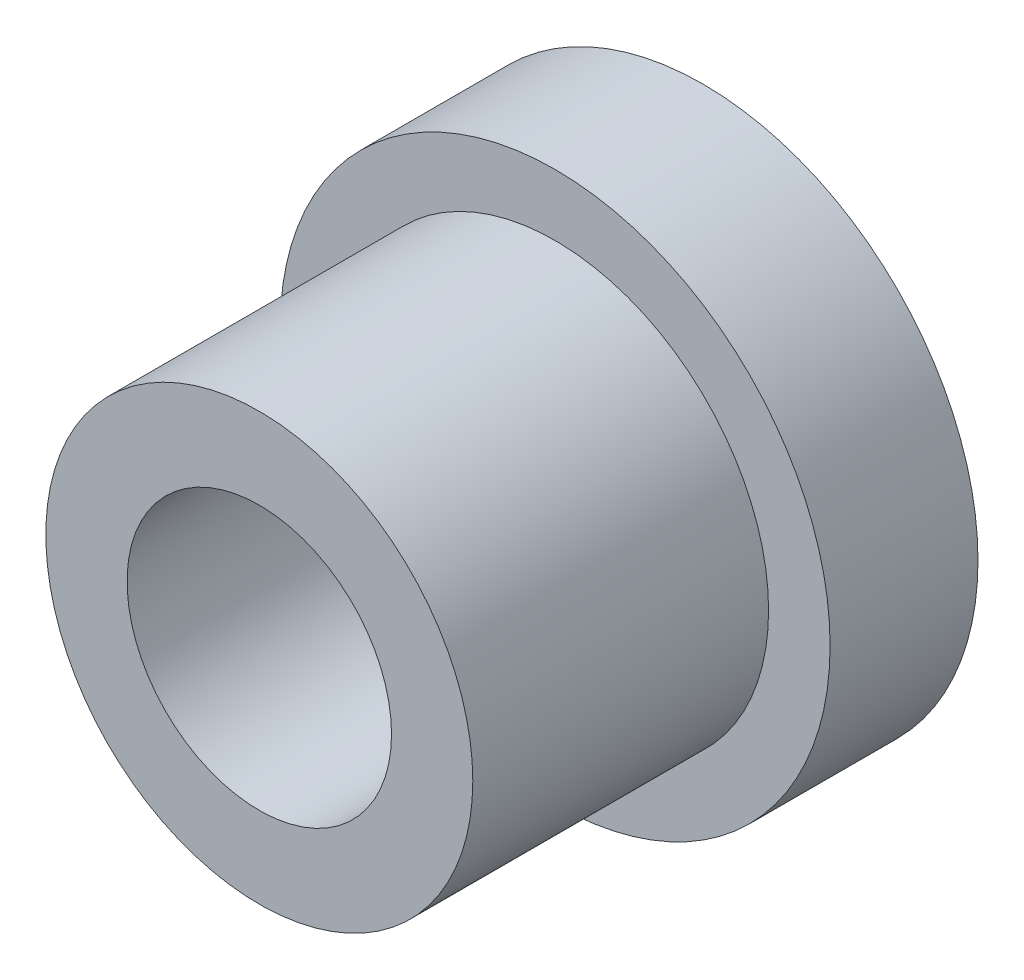
ISO-10303-21;
HEADER;
FILE_DESCRIPTION(('STEP AP214'),'2;1');
FILE_NAME('part.step','',(''),(''),'','','');
FILE_SCHEMA(('AUTOMOTIVE_DESIGN { 1 0 10303 214 1 1 1 1 }'));
ENDSEC;
DATA;
#1=APPLICATION_CONTEXT('core data for automotive mechanical design processes');
#2=APPLICATION_PROTOCOL_DEFINITION('international standard','automotive_design',2000,#1);
#3=PRODUCT_CONTEXT('',#1,'mechanical');
#4=PRODUCT('Part','Part','',(#3));
#5=PRODUCT_RELATED_PRODUCT_CATEGORY('part','',(#4));
#6=PRODUCT_DEFINITION_FORMATION('','',#4);
#7=PRODUCT_DEFINITION_CONTEXT('part definition',#1,'design');
#8=PRODUCT_DEFINITION('design','',#6,#7);
#9=PRODUCT_DEFINITION_SHAPE('','',#8);
#10=(LENGTH_UNIT() NAMED_UNIT(*) SI_UNIT(.MILLI.,.METRE.));
#11=(NAMED_UNIT(*) PLANE_ANGLE_UNIT() SI_UNIT($,.RADIAN.));
#12=(NAMED_UNIT(*) SI_UNIT($,.STERADIAN.) SOLID_ANGLE_UNIT());
#13=UNCERTAINTY_MEASURE_WITH_UNIT(LENGTH_MEASURE(1.E-05),#10,'distance_accuracy_value','');
#14=(GEOMETRIC_REPRESENTATION_CONTEXT(3) GLOBAL_UNCERTAINTY_ASSIGNED_CONTEXT((#13)) GLOBAL_UNIT_ASSIGNED_CONTEXT((#10,
#11,#12)) REPRESENTATION_CONTEXT('',''));
#15=CARTESIAN_POINT('',(0.,0.,0.));
#16=DIRECTION('',(0.,0.,1.));
#17=DIRECTION('',(1.,0.,0.));
#18=AXIS2_PLACEMENT_3D('',#15,#16,#17);
#19=CARTESIAN_POINT('',(0.,0.,10.));
#20=DIRECTION('',(0.,0.,1.));
#21=DIRECTION('',(1.,0.,0.));
#22=AXIS2_PLACEMENT_3D('',#19,#20,#21);
#23=PLANE('',#22);
#24=CARTESIAN_POINT('',(0.,0.,10.));
#25=DIRECTION('',(0.,0.,1.));
#26=DIRECTION('',(1.,0.,0.));
#27=AXIS2_PLACEMENT_3D('',#24,#25,#26);
#28=CIRCLE('',#27,7.21749079390016);
#29=CARTESIAN_POINT('',(7.21749079390016,0.,10.));
#30=VERTEX_POINT('',#29);
#31=EDGE_CURVE('E10',#30,#30,#28,.T.);
#32=ORIENTED_EDGE('',*,*,#31,.T.);
#33=EDGE_LOOP('',(#32));
#34=FACE_BOUND('',#33,.T.);
#35=CARTESIAN_POINT('',(0.,0.,10.));
#36=DIRECTION('',(0.,0.,1.));
#37=DIRECTION('',(1.,0.,0.));
#38=AXIS2_PLACEMENT_3D('',#35,#36,#37);
#39=CIRCLE('',#38,4.47);
#40=CARTESIAN_POINT('',(4.47,0.,10.));
#41=VERTEX_POINT('',#40);
#42=EDGE_CURVE('E39',#41,#41,#39,.T.);
#43=ORIENTED_EDGE('',*,*,#42,.F.);
#44=EDGE_LOOP('',(#43));
#45=FACE_BOUND('',#44,.T.);
#46=ADVANCED_FACE('F31',(#34,#45),#23,.T.);
#47=CARTESIAN_POINT('',(0.,0.,10.));
#48=DIRECTION('',(0.,0.,-1.));
#49=DIRECTION('',(-1.,0.,0.));
#50=AXIS2_PLACEMENT_3D('',#47,#48,#49);
#51=CYLINDRICAL_SURFACE('',#50,7.21749079390016);
#52=ORIENTED_EDGE('',*,*,#31,.F.);
#53=EDGE_LOOP('',(#52));
#54=FACE_BOUND('',#53,.T.);
#55=CARTESIAN_POINT('',(0.,0.,0.));
#56=DIRECTION('',(0.,0.,1.));
#57=DIRECTION('',(1.,0.,0.));
#58=AXIS2_PLACEMENT_3D('',#55,#56,#57);
#59=CIRCLE('',#58,7.21749079390016);
#60=CARTESIAN_POINT('',(7.21749079390016,0.,0.));
#61=VERTEX_POINT('',#60);
#62=EDGE_CURVE('E35',#61,#61,#59,.T.);
#63=ORIENTED_EDGE('',*,*,#62,.T.);
#64=EDGE_LOOP('',(#63));
#65=FACE_BOUND('',#64,.T.);
#66=ADVANCED_FACE('F33',(#54,#65),#51,.T.);
#67=CARTESIAN_POINT('',(0.,0.,10.));
#68=DIRECTION('',(0.,0.,-1.));
#69=DIRECTION('',(-1.,0.,0.));
#70=AXIS2_PLACEMENT_3D('',#67,#68,#69);
#71=CYLINDRICAL_SURFACE('',#70,4.47);
#72=ORIENTED_EDGE('',*,*,#42,.T.);
#73=EDGE_LOOP('',(#72));
#74=FACE_BOUND('',#73,.T.);
#75=CARTESIAN_POINT('',(0.,0.,0.));
#76=DIRECTION('',(0.,0.,1.));
#77=DIRECTION('',(1.,0.,0.));
#78=AXIS2_PLACEMENT_3D('',#75,#76,#77);
#79=CIRCLE('',#78,4.47);
#80=CARTESIAN_POINT('',(4.47,0.,0.));
#81=VERTEX_POINT('',#80);
#82=EDGE_CURVE('E43',#81,#81,#79,.T.);
#83=ORIENTED_EDGE('',*,*,#82,.F.);
#84=EDGE_LOOP('',(#83));
#85=FACE_BOUND('',#84,.T.);
#86=ADVANCED_FACE('F76',(#74,#85),#71,.F.);
#87=CARTESIAN_POINT('',(0.,0.,0.));
#88=DIRECTION('',(0.,0.,-1.));
#89=DIRECTION('',(-1.,0.,0.));
#90=AXIS2_PLACEMENT_3D('',#87,#88,#89);
#91=PLANE('',#90);
#92=ORIENTED_EDGE('',*,*,#82,.T.);
#93=EDGE_LOOP('',(#92));
#94=FACE_BOUND('',#93,.T.);
#95=ADVANCED_FACE('F64',(#94),#91,.F.);
#96=CARTESIAN_POINT('',(0.,0.,-5.));
#97=DIRECTION('',(0.,0.,1.));
#98=DIRECTION('',(1.,0.,0.));
#99=AXIS2_PLACEMENT_3D('',#96,#97,#98);
#100=CYLINDRICAL_SURFACE('',#99,9.29699823995041);
#101=CARTESIAN_POINT('',(0.,0.,-5.));
#102=DIRECTION('',(0.,0.,-1.));
#103=DIRECTION('',(-1.,0.,0.));
#104=AXIS2_PLACEMENT_3D('',#101,#102,#103);
#105=CIRCLE('',#104,9.29699823995041);
#106=CARTESIAN_POINT('',(-9.29699823995041,0.,-5.));
#107=VERTEX_POINT('',#106);
#108=EDGE_CURVE('E51',#107,#107,#105,.T.);
#109=ORIENTED_EDGE('',*,*,#108,.F.);
#110=EDGE_LOOP('',(#109));
#111=FACE_BOUND('',#110,.T.);
#112=CARTESIAN_POINT('',(0.,0.,0.));
#113=DIRECTION('',(0.,0.,-1.));
#114=DIRECTION('',(-1.,0.,0.));
#115=AXIS2_PLACEMENT_3D('',#112,#113,#114);
#116=CIRCLE('',#115,9.29699823995041);
#117=CARTESIAN_POINT('',(-9.29699823995041,0.,0.));
#118=VERTEX_POINT('',#117);
#119=EDGE_CURVE('E48',#118,#118,#116,.T.);
#120=ORIENTED_EDGE('',*,*,#119,.T.);
#121=EDGE_LOOP('',(#120));
#122=FACE_BOUND('',#121,.T.);
#123=ADVANCED_FACE('F67',(#111,#122),#100,.T.);
#124=CARTESIAN_POINT('',(0.,0.,-5.));
#125=DIRECTION('',(0.,0.,-1.));
#126=DIRECTION('',(-1.,0.,0.));
#127=AXIS2_PLACEMENT_3D('',#124,#125,#126);
#128=PLANE('',#127);
#129=ORIENTED_EDGE('',*,*,#108,.T.);
#130=EDGE_LOOP('',(#129));
#131=FACE_BOUND('',#130,.T.);
#132=ADVANCED_FACE('F62',(#131),#128,.T.);
#133=ORIENTED_EDGE('',*,*,#62,.F.);
#134=EDGE_LOOP('',(#133));
#135=FACE_BOUND('',#134,.T.);
#136=ORIENTED_EDGE('',*,*,#119,.F.);
#137=EDGE_LOOP('',(#136));
#138=FACE_BOUND('',#137,.T.);
#139=ADVANCED_FACE('F59',(#135,#138),#91,.F.);
#140=CLOSED_SHELL('',(#46,#66,#86,#95,#123,#132,#139));
#141=MANIFOLD_SOLID_BREP('B2',#140);
#142=ADVANCED_BREP_SHAPE_REPRESENTATION('',(#18,#141),#14);
#143=SHAPE_DEFINITION_REPRESENTATION(#9,#142);
ENDSEC;
END-ISO-10303-21;
